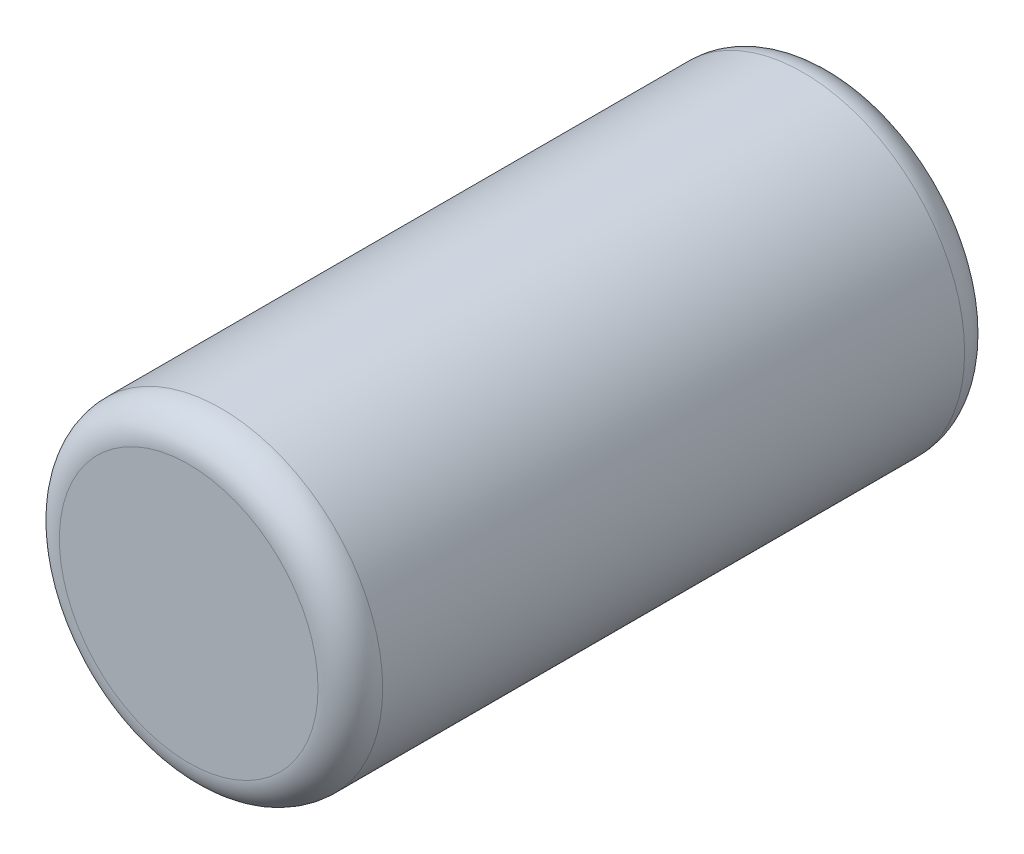
ISO-10303-21;
HEADER;
FILE_DESCRIPTION(('STEP AP214'),'2;1');
FILE_NAME('part.step','',(''),(''),'','','');
FILE_SCHEMA(('AUTOMOTIVE_DESIGN { 1 0 10303 214 1 1 1 1 }'));
ENDSEC;
DATA;
#1=APPLICATION_CONTEXT('core data for automotive mechanical design processes');
#2=APPLICATION_PROTOCOL_DEFINITION('international standard','automotive_design',2000,#1);
#3=PRODUCT_CONTEXT('',#1,'mechanical');
#4=PRODUCT('Part','Part','',(#3));
#5=PRODUCT_RELATED_PRODUCT_CATEGORY('part','',(#4));
#6=PRODUCT_DEFINITION_FORMATION('','',#4);
#7=PRODUCT_DEFINITION_CONTEXT('part definition',#1,'design');
#8=PRODUCT_DEFINITION('design','',#6,#7);
#9=PRODUCT_DEFINITION_SHAPE('','',#8);
#10=(LENGTH_UNIT() NAMED_UNIT(*) SI_UNIT(.MILLI.,.METRE.));
#11=(NAMED_UNIT(*) PLANE_ANGLE_UNIT() SI_UNIT($,.RADIAN.));
#12=(NAMED_UNIT(*) SI_UNIT($,.STERADIAN.) SOLID_ANGLE_UNIT());
#13=UNCERTAINTY_MEASURE_WITH_UNIT(LENGTH_MEASURE(1.E-05),#10,'distance_accuracy_value','');
#14=(GEOMETRIC_REPRESENTATION_CONTEXT(3) GLOBAL_UNCERTAINTY_ASSIGNED_CONTEXT((#13)) GLOBAL_UNIT_ASSIGNED_CONTEXT((#10,
#11,#12)) REPRESENTATION_CONTEXT('',''));
#15=CARTESIAN_POINT('',(0.,0.,0.));
#16=DIRECTION('',(0.,0.,1.));
#17=DIRECTION('',(1.,0.,0.));
#18=AXIS2_PLACEMENT_3D('',#15,#16,#17);
#19=CARTESIAN_POINT('',(0.,0.,2.54));
#20=DIRECTION('',(0.,0.,-1.));
#21=DIRECTION('',(-1.,0.,0.));
#22=AXIS2_PLACEMENT_3D('',#19,#20,#21);
#23=CYLINDRICAL_SURFACE('',#22,1.27);
#24=CARTESIAN_POINT('',(0.,0.,-2.286));
#25=DIRECTION('',(0.,0.,1.));
#26=DIRECTION('',(1.,0.,0.));
#27=AXIS2_PLACEMENT_3D('',#24,#25,#26);
#28=CIRCLE('',#27,1.27);
#29=CARTESIAN_POINT('',(1.27,0.,-2.286));
#30=VERTEX_POINT('',#29);
#31=EDGE_CURVE('E47',#30,#30,#28,.T.);
#32=ORIENTED_EDGE('',*,*,#31,.T.);
#33=EDGE_LOOP('',(#32));
#34=FACE_BOUND('',#33,.T.);
#35=CARTESIAN_POINT('',(0.,0.,2.286));
#36=DIRECTION('',(0.,0.,1.));
#37=DIRECTION('',(1.,0.,0.));
#38=AXIS2_PLACEMENT_3D('',#35,#36,#37);
#39=CIRCLE('',#38,1.27);
#40=CARTESIAN_POINT('',(1.27,0.,2.286));
#41=VERTEX_POINT('',#40);
#42=EDGE_CURVE('E51',#41,#41,#39,.F.);
#43=ORIENTED_EDGE('',*,*,#42,.T.);
#44=EDGE_LOOP('',(#43));
#45=FACE_BOUND('',#44,.T.);
#46=ADVANCED_FACE('F36',(#34,#45),#23,.T.);
#47=CARTESIAN_POINT('',(0.,0.,2.54));
#48=DIRECTION('',(0.,0.,1.));
#49=DIRECTION('',(1.,0.,0.));
#50=AXIS2_PLACEMENT_3D('',#47,#48,#49);
#51=PLANE('',#50);
#52=CARTESIAN_POINT('',(0.,0.,2.54));
#53=DIRECTION('',(0.,0.,1.));
#54=DIRECTION('',(1.,0.,0.));
#55=AXIS2_PLACEMENT_3D('',#52,#53,#54);
#56=CIRCLE('',#55,1.016);
#57=CARTESIAN_POINT('',(1.016,0.,2.54));
#58=VERTEX_POINT('',#57);
#59=EDGE_CURVE('E10',#58,#58,#56,.T.);
#60=ORIENTED_EDGE('',*,*,#59,.T.);
#61=EDGE_LOOP('',(#60));
#62=FACE_BOUND('',#61,.T.);
#63=ADVANCED_FACE('F67',(#62),#51,.T.);
#64=CARTESIAN_POINT('',(0.,0.,-2.54));
#65=DIRECTION('',(0.,0.,1.));
#66=DIRECTION('',(1.,0.,0.));
#67=AXIS2_PLACEMENT_3D('',#64,#65,#66);
#68=PLANE('',#67);
#69=CARTESIAN_POINT('',(0.,0.,-2.54));
#70=DIRECTION('',(0.,0.,1.));
#71=DIRECTION('',(1.,0.,0.));
#72=AXIS2_PLACEMENT_3D('',#69,#70,#71);
#73=CIRCLE('',#72,1.016);
#74=CARTESIAN_POINT('',(1.016,0.,-2.54));
#75=VERTEX_POINT('',#74);
#76=EDGE_CURVE('E43',#75,#75,#73,.F.);
#77=ORIENTED_EDGE('',*,*,#76,.T.);
#78=EDGE_LOOP('',(#77));
#79=FACE_BOUND('',#78,.T.);
#80=ADVANCED_FACE('F64',(#79),#68,.F.);
#81=CARTESIAN_POINT('',(0.,0.,-2.286));
#82=DIRECTION('',(0.,0.,1.));
#83=DIRECTION('',(1.,0.,0.));
#84=AXIS2_PLACEMENT_3D('',#81,#82,#83);
#85=TOROIDAL_SURFACE('',#84,1.016,0.254);
#86=ORIENTED_EDGE('',*,*,#76,.F.);
#87=EDGE_LOOP('',(#86));
#88=FACE_BOUND('',#87,.T.);
#89=ORIENTED_EDGE('',*,*,#31,.F.);
#90=EDGE_LOOP('',(#89));
#91=FACE_BOUND('',#90,.T.);
#92=ADVANCED_FACE('F60',(#88,#91),#85,.T.);
#93=CARTESIAN_POINT('',(0.,0.,2.286));
#94=DIRECTION('',(0.,0.,1.));
#95=DIRECTION('',(1.,0.,0.));
#96=AXIS2_PLACEMENT_3D('',#93,#94,#95);
#97=TOROIDAL_SURFACE('',#96,1.016,0.254);
#98=ORIENTED_EDGE('',*,*,#42,.F.);
#99=EDGE_LOOP('',(#98));
#100=FACE_BOUND('',#99,.T.);
#101=ORIENTED_EDGE('',*,*,#59,.F.);
#102=EDGE_LOOP('',(#101));
#103=FACE_BOUND('',#102,.T.);
#104=ADVANCED_FACE('F38',(#100,#103),#97,.T.);
#105=CLOSED_SHELL('',(#46,#63,#80,#92,#104));
#106=MANIFOLD_SOLID_BREP('B2',#105);
#107=ADVANCED_BREP_SHAPE_REPRESENTATION('',(#18,#106),#14);
#108=SHAPE_DEFINITION_REPRESENTATION(#9,#107);
ENDSEC;
END-ISO-10303-21;
